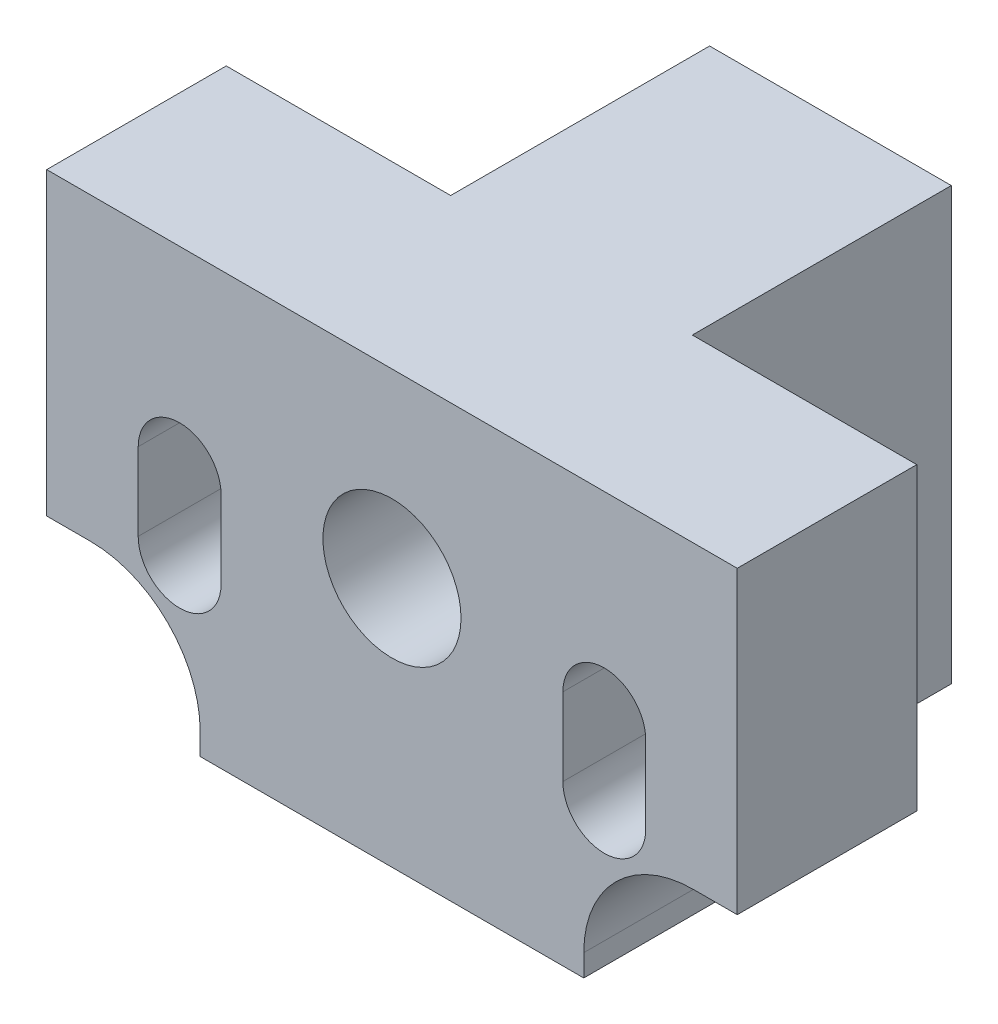
ISO-10303-21;
HEADER;
FILE_DESCRIPTION(('STEP AP214'),'2;1');
FILE_NAME('part.step','',(''),(''),'','','');
FILE_SCHEMA(('AUTOMOTIVE_DESIGN { 1 0 10303 214 1 1 1 1 }'));
ENDSEC;
DATA;
#1=APPLICATION_CONTEXT('core data for automotive mechanical design processes');
#2=APPLICATION_PROTOCOL_DEFINITION('international standard','automotive_design',2000,#1);
#3=PRODUCT_CONTEXT('',#1,'mechanical');
#4=PRODUCT('Part','Part','',(#3));
#5=PRODUCT_RELATED_PRODUCT_CATEGORY('part','',(#4));
#6=PRODUCT_DEFINITION_FORMATION('','',#4);
#7=PRODUCT_DEFINITION_CONTEXT('part definition',#1,'design');
#8=PRODUCT_DEFINITION('design','',#6,#7);
#9=PRODUCT_DEFINITION_SHAPE('','',#8);
#10=(LENGTH_UNIT() NAMED_UNIT(*) SI_UNIT(.MILLI.,.METRE.));
#11=(NAMED_UNIT(*) PLANE_ANGLE_UNIT() SI_UNIT($,.RADIAN.));
#12=(NAMED_UNIT(*) SI_UNIT($,.STERADIAN.) SOLID_ANGLE_UNIT());
#13=UNCERTAINTY_MEASURE_WITH_UNIT(LENGTH_MEASURE(1.E-05),#10,'distance_accuracy_value','');
#14=(GEOMETRIC_REPRESENTATION_CONTEXT(3) GLOBAL_UNCERTAINTY_ASSIGNED_CONTEXT((#13)) GLOBAL_UNIT_ASSIGNED_CONTEXT((#10,
#11,#12)) REPRESENTATION_CONTEXT('',''));
#15=CARTESIAN_POINT('',(0.,0.,0.));
#16=DIRECTION('',(0.,0.,1.));
#17=DIRECTION('',(1.,0.,0.));
#18=AXIS2_PLACEMENT_3D('',#15,#16,#17);
#19=CARTESIAN_POINT('',(-7.,25.,-25.4));
#20=DIRECTION('',(0.,0.,1.));
#21=DIRECTION('',(1.,0.,0.));
#22=AXIS2_PLACEMENT_3D('',#19,#20,#21);
#23=PLANE('',#22);
#24=DIRECTION('',(0.,-1.,0.));
#25=VECTOR('',#24,1.);
#26=CARTESIAN_POINT('',(7.,25.,-25.4));
#27=LINE('',#26,#25);
#28=CARTESIAN_POINT('',(7.,25.,-25.4));
#29=VERTEX_POINT('',#28);
#30=CARTESIAN_POINT('',(7.,0.,-25.4));
#31=VERTEX_POINT('',#30);
#32=EDGE_CURVE('E240',#29,#31,#27,.T.);
#33=ORIENTED_EDGE('',*,*,#32,.T.);
#34=DIRECTION('',(-1.,0.,0.));
#35=VECTOR('',#34,1.);
#36=CARTESIAN_POINT('',(-7.,0.,-25.4));
#37=LINE('',#36,#35);
#38=CARTESIAN_POINT('',(-7.,0.,-25.4));
#39=VERTEX_POINT('',#38);
#40=EDGE_CURVE('E328',#31,#39,#37,.T.);
#41=ORIENTED_EDGE('',*,*,#40,.T.);
#42=DIRECTION('',(0.,-1.,0.));
#43=VECTOR('',#42,1.);
#44=CARTESIAN_POINT('',(-7.,25.,-25.4));
#45=LINE('',#44,#43);
#46=CARTESIAN_POINT('',(-7.,25.,-25.4));
#47=VERTEX_POINT('',#46);
#48=EDGE_CURVE('E11',#47,#39,#45,.T.);
#49=ORIENTED_EDGE('',*,*,#48,.F.);
#50=DIRECTION('',(-1.,0.,0.));
#51=VECTOR('',#50,1.);
#52=CARTESIAN_POINT('',(-7.,25.,-25.4));
#53=LINE('',#52,#51);
#54=EDGE_CURVE('E329',#29,#47,#53,.T.);
#55=ORIENTED_EDGE('',*,*,#54,.F.);
#56=EDGE_LOOP('',(#33,#41,#49,#55));
#57=FACE_BOUND('',#56,.T.);
#58=CARTESIAN_POINT('',(0.,14.493996950254,-25.4));
#59=DIRECTION('',(0.,0.,1.));
#60=DIRECTION('',(1.,0.,0.));
#61=AXIS2_PLACEMENT_3D('',#58,#59,#60);
#62=CIRCLE('',#61,4.);
#63=CARTESIAN_POINT('',(4.,14.493996950254,-25.4));
#64=VERTEX_POINT('',#63);
#65=EDGE_CURVE('E279',#64,#64,#62,.T.);
#66=ORIENTED_EDGE('',*,*,#65,.T.);
#67=EDGE_LOOP('',(#66));
#68=FACE_BOUND('',#67,.T.);
#69=ADVANCED_FACE('F45',(#57,#68),#23,.F.);
#70=CARTESIAN_POINT('',(-7.,25.,-10.4));
#71=DIRECTION('',(1.,0.,0.));
#72=DIRECTION('',(0.,0.,-1.));
#73=AXIS2_PLACEMENT_3D('',#70,#71,#72);
#74=PLANE('',#73);
#75=DIRECTION('',(0.,0.,1.));
#76=VECTOR('',#75,1.);
#77=CARTESIAN_POINT('',(-7.,0.,-10.4));
#78=LINE('',#77,#76);
#79=CARTESIAN_POINT('',(-7.,0.,-10.4));
#80=VERTEX_POINT('',#79);
#81=EDGE_CURVE('E348',#39,#80,#78,.T.);
#82=ORIENTED_EDGE('',*,*,#81,.T.);
#83=DIRECTION('',(0.,-1.,0.));
#84=VECTOR('',#83,1.);
#85=CARTESIAN_POINT('',(-7.,25.,-10.4));
#86=LINE('',#85,#84);
#87=CARTESIAN_POINT('',(-7.,25.,-10.4));
#88=VERTEX_POINT('',#87);
#89=EDGE_CURVE('E53',#88,#80,#86,.T.);
#90=ORIENTED_EDGE('',*,*,#89,.F.);
#91=DIRECTION('',(0.,0.,1.));
#92=VECTOR('',#91,1.);
#93=CARTESIAN_POINT('',(-7.,25.,-10.4));
#94=LINE('',#93,#92);
#95=EDGE_CURVE('E332',#47,#88,#94,.T.);
#96=ORIENTED_EDGE('',*,*,#95,.F.);
#97=ORIENTED_EDGE('',*,*,#48,.T.);
#98=EDGE_LOOP('',(#82,#90,#96,#97));
#99=FACE_BOUND('',#98,.T.);
#100=ADVANCED_FACE('F395',(#99),#74,.F.);
#101=CARTESIAN_POINT('',(-20.,25.,-10.4));
#102=DIRECTION('',(0.,0.,1.));
#103=DIRECTION('',(1.,0.,0.));
#104=AXIS2_PLACEMENT_3D('',#101,#102,#103);
#105=PLANE('',#104);
#106=DIRECTION('',(0.,1.,0.));
#107=VECTOR('',#106,1.);
#108=CARTESIAN_POINT('',(-9.90000000000001,25.,-10.4));
#109=LINE('',#108,#107);
#110=CARTESIAN_POINT('',(-9.9,9.25,-10.4));
#111=VERTEX_POINT('',#110);
#112=CARTESIAN_POINT('',(-9.9,13.75,-10.4));
#113=VERTEX_POINT('',#112);
#114=EDGE_CURVE('E320',#111,#113,#109,.T.);
#115=ORIENTED_EDGE('',*,*,#114,.T.);
#116=CARTESIAN_POINT('',(-12.3,13.75,-10.4));
#117=DIRECTION('',(0.,0.,1.));
#118=DIRECTION('',(1.,0.,0.));
#119=AXIS2_PLACEMENT_3D('',#116,#117,#118);
#120=CIRCLE('',#119,2.4);
#121=CARTESIAN_POINT('',(-14.7,13.75,-10.4));
#122=VERTEX_POINT('',#121);
#123=EDGE_CURVE('E324',#113,#122,#120,.T.);
#124=ORIENTED_EDGE('',*,*,#123,.T.);
#125=DIRECTION('',(0.,-1.,0.));
#126=VECTOR('',#125,1.);
#127=CARTESIAN_POINT('',(-14.7,25.,-10.4));
#128=LINE('',#127,#126);
#129=CARTESIAN_POINT('',(-14.7,9.25,-10.4));
#130=VERTEX_POINT('',#129);
#131=EDGE_CURVE('E304',#122,#130,#128,.T.);
#132=ORIENTED_EDGE('',*,*,#131,.T.);
#133=CARTESIAN_POINT('',(-12.3,9.25,-10.4));
#134=DIRECTION('',(0.,0.,1.));
#135=DIRECTION('',(1.,0.,0.));
#136=AXIS2_PLACEMENT_3D('',#133,#134,#135);
#137=CIRCLE('',#136,2.4);
#138=EDGE_CURVE('E316',#130,#111,#137,.T.);
#139=ORIENTED_EDGE('',*,*,#138,.T.);
#140=EDGE_LOOP('',(#115,#124,#132,#139));
#141=FACE_BOUND('',#140,.T.);
#142=DIRECTION('',(-1.,0.,0.));
#143=VECTOR('',#142,1.);
#144=CARTESIAN_POINT('',(-20.,0.,-10.4));
#145=LINE('',#144,#143);
#146=CARTESIAN_POINT('',(-11.11,0.,-10.4));
#147=VERTEX_POINT('',#146);
#148=EDGE_CURVE('E351',#80,#147,#145,.T.);
#149=ORIENTED_EDGE('',*,*,#148,.T.);
#150=DIRECTION('',(0.,-1.,0.));
#151=VECTOR('',#150,1.);
#152=CARTESIAN_POINT('',(-11.11,0.,-10.4));
#153=LINE('',#152,#151);
#154=CARTESIAN_POINT('',(-11.11,1.27,-10.4));
#155=VERTEX_POINT('',#154);
#156=EDGE_CURVE('E60',#155,#147,#153,.T.);
#157=ORIENTED_EDGE('',*,*,#156,.F.);
#158=CARTESIAN_POINT('',(-17.46,1.27,-10.4));
#159=DIRECTION('',(0.,0.,-1.));
#160=DIRECTION('',(-1.,0.,0.));
#161=AXIS2_PLACEMENT_3D('',#158,#159,#160);
#162=CIRCLE('',#161,6.35);
#163=CARTESIAN_POINT('',(-17.46,7.62,-10.4));
#164=VERTEX_POINT('',#163);
#165=EDGE_CURVE('E261',#164,#155,#162,.T.);
#166=ORIENTED_EDGE('',*,*,#165,.F.);
#167=DIRECTION('',(1.,0.,0.));
#168=VECTOR('',#167,1.);
#169=CARTESIAN_POINT('',(-17.46,7.62,-10.4));
#170=LINE('',#169,#168);
#171=CARTESIAN_POINT('',(-20.,7.62,-10.4));
#172=VERTEX_POINT('',#171);
#173=EDGE_CURVE('E244',#172,#164,#170,.T.);
#174=ORIENTED_EDGE('',*,*,#173,.F.);
#175=DIRECTION('',(0.,-1.,0.));
#176=VECTOR('',#175,1.);
#177=CARTESIAN_POINT('',(-20.,25.,-10.4));
#178=LINE('',#177,#176);
#179=CARTESIAN_POINT('',(-20.,25.,-10.4));
#180=VERTEX_POINT('',#179);
#181=EDGE_CURVE('E360',#180,#172,#178,.T.);
#182=ORIENTED_EDGE('',*,*,#181,.F.);
#183=DIRECTION('',(-1.,0.,0.));
#184=VECTOR('',#183,1.);
#185=CARTESIAN_POINT('',(-20.,25.,-10.4));
#186=LINE('',#185,#184);
#187=EDGE_CURVE('E336',#88,#180,#186,.T.);
#188=ORIENTED_EDGE('',*,*,#187,.F.);
#189=ORIENTED_EDGE('',*,*,#89,.T.);
#190=EDGE_LOOP('',(#149,#157,#166,#174,#182,#188,#189));
#191=FACE_BOUND('',#190,.T.);
#192=ADVANCED_FACE('F369',(#141,#191),#105,.F.);
#193=CARTESIAN_POINT('',(-20.,25.,0.));
#194=DIRECTION('',(1.,0.,0.));
#195=DIRECTION('',(0.,0.,-1.));
#196=AXIS2_PLACEMENT_3D('',#193,#194,#195);
#197=PLANE('',#196);
#198=ORIENTED_EDGE('',*,*,#181,.T.);
#199=DIRECTION('',(0.,0.,-1.));
#200=VECTOR('',#199,1.);
#201=CARTESIAN_POINT('',(-20.,7.62,0.));
#202=LINE('',#201,#200);
#203=CARTESIAN_POINT('',(-20.,7.62,0.));
#204=VERTEX_POINT('',#203);
#205=EDGE_CURVE('E257',#204,#172,#202,.T.);
#206=ORIENTED_EDGE('',*,*,#205,.F.);
#207=DIRECTION('',(0.,-1.,0.));
#208=VECTOR('',#207,1.);
#209=CARTESIAN_POINT('',(-20.,25.,0.));
#210=LINE('',#209,#208);
#211=CARTESIAN_POINT('',(-20.,25.,0.));
#212=VERTEX_POINT('',#211);
#213=EDGE_CURVE('E345',#212,#204,#210,.T.);
#214=ORIENTED_EDGE('',*,*,#213,.F.);
#215=DIRECTION('',(0.,0.,1.));
#216=VECTOR('',#215,1.);
#217=CARTESIAN_POINT('',(-20.,25.,0.));
#218=LINE('',#217,#216);
#219=EDGE_CURVE('E339',#180,#212,#218,.T.);
#220=ORIENTED_EDGE('',*,*,#219,.F.);
#221=EDGE_LOOP('',(#198,#206,#214,#220));
#222=FACE_BOUND('',#221,.T.);
#223=ADVANCED_FACE('F389',(#222),#197,.F.);
#224=CARTESIAN_POINT('',(0.,25.,0.));
#225=DIRECTION('',(0.,0.,-1.));
#226=DIRECTION('',(-1.,0.,0.));
#227=AXIS2_PLACEMENT_3D('',#224,#225,#226);
#228=PLANE('',#227);
#229=DIRECTION('',(1.,0.,0.));
#230=VECTOR('',#229,1.);
#231=CARTESIAN_POINT('',(0.,0.,0.));
#232=LINE('',#231,#230);
#233=CARTESIAN_POINT('',(-11.11,0.,0.));
#234=VERTEX_POINT('',#233);
#235=CARTESIAN_POINT('',(11.11,0.,0.));
#236=VERTEX_POINT('',#235);
#237=EDGE_CURVE('E333',#234,#236,#232,.T.);
#238=ORIENTED_EDGE('',*,*,#237,.T.);
#239=DIRECTION('',(0.,-1.,0.));
#240=VECTOR('',#239,1.);
#241=CARTESIAN_POINT('',(11.11,0.,0.));
#242=LINE('',#241,#240);
#243=CARTESIAN_POINT('',(11.11,1.27,0.));
#244=VERTEX_POINT('',#243);
#245=EDGE_CURVE('E220',#244,#236,#242,.T.);
#246=ORIENTED_EDGE('',*,*,#245,.F.);
#247=CARTESIAN_POINT('',(17.46,1.27,0.));
#248=DIRECTION('',(0.,0.,1.));
#249=DIRECTION('',(1.,0.,0.));
#250=AXIS2_PLACEMENT_3D('',#247,#248,#249);
#251=CIRCLE('',#250,6.35);
#252=CARTESIAN_POINT('',(17.46,7.62,0.));
#253=VERTEX_POINT('',#252);
#254=EDGE_CURVE('E205',#253,#244,#251,.T.);
#255=ORIENTED_EDGE('',*,*,#254,.F.);
#256=DIRECTION('',(-1.,0.,0.));
#257=VECTOR('',#256,1.);
#258=CARTESIAN_POINT('',(17.46,7.62,0.));
#259=LINE('',#258,#257);
#260=CARTESIAN_POINT('',(20.,7.62,0.));
#261=VERTEX_POINT('',#260);
#262=EDGE_CURVE('E195',#261,#253,#259,.T.);
#263=ORIENTED_EDGE('',*,*,#262,.F.);
#264=DIRECTION('',(0.,-1.,0.));
#265=VECTOR('',#264,1.);
#266=CARTESIAN_POINT('',(20.,25.,0.));
#267=LINE('',#266,#265);
#268=CARTESIAN_POINT('',(20.,25.,0.));
#269=VERTEX_POINT('',#268);
#270=EDGE_CURVE('E201',#269,#261,#267,.T.);
#271=ORIENTED_EDGE('',*,*,#270,.F.);
#272=DIRECTION('',(1.,0.,0.));
#273=VECTOR('',#272,1.);
#274=CARTESIAN_POINT('',(0.,25.,0.));
#275=LINE('',#274,#273);
#276=EDGE_CURVE('E342',#212,#269,#275,.T.);
#277=ORIENTED_EDGE('',*,*,#276,.F.);
#278=ORIENTED_EDGE('',*,*,#213,.T.);
#279=DIRECTION('',(1.,0.,0.));
#280=VECTOR('',#279,1.);
#281=CARTESIAN_POINT('',(-17.46,7.62,0.));
#282=LINE('',#281,#280);
#283=CARTESIAN_POINT('',(-17.46,7.62,0.));
#284=VERTEX_POINT('',#283);
#285=EDGE_CURVE('E245',#204,#284,#282,.T.);
#286=ORIENTED_EDGE('',*,*,#285,.T.);
#287=CARTESIAN_POINT('',(-17.46,1.27,0.));
#288=DIRECTION('',(0.,0.,-1.));
#289=DIRECTION('',(-1.,0.,0.));
#290=AXIS2_PLACEMENT_3D('',#287,#288,#289);
#291=CIRCLE('',#290,6.35);
#292=CARTESIAN_POINT('',(-11.11,1.27,0.));
#293=VERTEX_POINT('',#292);
#294=EDGE_CURVE('E249',#284,#293,#291,.T.);
#295=ORIENTED_EDGE('',*,*,#294,.T.);
#296=DIRECTION('',(0.,-1.,0.));
#297=VECTOR('',#296,1.);
#298=CARTESIAN_POINT('',(-11.11,0.,0.));
#299=LINE('',#298,#297);
#300=EDGE_CURVE('E253',#293,#234,#299,.T.);
#301=ORIENTED_EDGE('',*,*,#300,.T.);
#302=EDGE_LOOP('',(#238,#246,#255,#263,#271,#277,#278,#286,#295,#301));
#303=FACE_BOUND('',#302,.T.);
#304=DIRECTION('',(0.,-1.,0.));
#305=VECTOR('',#304,1.);
#306=CARTESIAN_POINT('',(-14.7,13.75,0.));
#307=LINE('',#306,#305);
#308=CARTESIAN_POINT('',(-14.7,13.75,0.));
#309=VERTEX_POINT('',#308);
#310=CARTESIAN_POINT('',(-14.7,9.25,0.));
#311=VERTEX_POINT('',#310);
#312=EDGE_CURVE('E289',#309,#311,#307,.T.);
#313=ORIENTED_EDGE('',*,*,#312,.F.);
#314=CARTESIAN_POINT('',(-12.3,13.75,0.));
#315=DIRECTION('',(0.,0.,1.));
#316=DIRECTION('',(1.,0.,0.));
#317=AXIS2_PLACEMENT_3D('',#314,#315,#316);
#318=CIRCLE('',#317,2.4);
#319=CARTESIAN_POINT('',(-9.9,13.75,0.));
#320=VERTEX_POINT('',#319);
#321=EDGE_CURVE('E283',#320,#309,#318,.T.);
#322=ORIENTED_EDGE('',*,*,#321,.F.);
#323=DIRECTION('',(0.,1.,0.));
#324=VECTOR('',#323,1.);
#325=CARTESIAN_POINT('',(-9.9,13.75,0.));
#326=LINE('',#325,#324);
#327=CARTESIAN_POINT('',(-9.9,9.25,0.));
#328=VERTEX_POINT('',#327);
#329=EDGE_CURVE('E296',#328,#320,#326,.T.);
#330=ORIENTED_EDGE('',*,*,#329,.F.);
#331=CARTESIAN_POINT('',(-12.3,9.25,0.));
#332=DIRECTION('',(0.,0.,1.));
#333=DIRECTION('',(1.,0.,0.));
#334=AXIS2_PLACEMENT_3D('',#331,#332,#333);
#335=CIRCLE('',#334,2.4);
#336=EDGE_CURVE('E292',#311,#328,#335,.T.);
#337=ORIENTED_EDGE('',*,*,#336,.F.);
#338=EDGE_LOOP('',(#313,#322,#330,#337));
#339=FACE_BOUND('',#338,.T.);
#340=CARTESIAN_POINT('',(0.,14.493996950254,0.));
#341=DIRECTION('',(0.,0.,1.));
#342=DIRECTION('',(1.,0.,0.));
#343=AXIS2_PLACEMENT_3D('',#340,#341,#342);
#344=CIRCLE('',#343,4.);
#345=CARTESIAN_POINT('',(4.,14.493996950254,0.));
#346=VERTEX_POINT('',#345);
#347=EDGE_CURVE('E270',#346,#346,#344,.T.);
#348=ORIENTED_EDGE('',*,*,#347,.F.);
#349=EDGE_LOOP('',(#348));
#350=FACE_BOUND('',#349,.T.);
#351=DIRECTION('',(0.,-1.,0.));
#352=VECTOR('',#351,1.);
#353=CARTESIAN_POINT('',(14.7,13.75,0.));
#354=LINE('',#353,#352);
#355=CARTESIAN_POINT('',(14.7,13.75,0.));
#356=VERTEX_POINT('',#355);
#357=CARTESIAN_POINT('',(14.7,9.25,0.));
#358=VERTEX_POINT('',#357);
#359=EDGE_CURVE('E452',#356,#358,#354,.T.);
#360=ORIENTED_EDGE('',*,*,#359,.T.);
#361=CARTESIAN_POINT('',(12.3,9.25,0.));
#362=DIRECTION('',(0.,0.,-1.));
#363=DIRECTION('',(-1.,0.,0.));
#364=AXIS2_PLACEMENT_3D('',#361,#362,#363);
#365=CIRCLE('',#364,2.4);
#366=CARTESIAN_POINT('',(9.9,9.25,0.));
#367=VERTEX_POINT('',#366);
#368=EDGE_CURVE('E448',#358,#367,#365,.T.);
#369=ORIENTED_EDGE('',*,*,#368,.T.);
#370=DIRECTION('',(0.,1.,0.));
#371=VECTOR('',#370,1.);
#372=CARTESIAN_POINT('',(9.9,13.75,0.));
#373=LINE('',#372,#371);
#374=CARTESIAN_POINT('',(9.9,13.75,0.));
#375=VERTEX_POINT('',#374);
#376=EDGE_CURVE('E437',#367,#375,#373,.T.);
#377=ORIENTED_EDGE('',*,*,#376,.T.);
#378=CARTESIAN_POINT('',(12.3,13.75,0.));
#379=DIRECTION('',(0.,0.,-1.));
#380=DIRECTION('',(-1.,0.,0.));
#381=AXIS2_PLACEMENT_3D('',#378,#379,#380);
#382=CIRCLE('',#381,2.4);
#383=EDGE_CURVE('E456',#375,#356,#382,.T.);
#384=ORIENTED_EDGE('',*,*,#383,.T.);
#385=EDGE_LOOP('',(#360,#369,#377,#384));
#386=FACE_BOUND('',#385,.T.);
#387=ADVANCED_FACE('F197',(#303,#339,#350,#386),#228,.F.);
#388=CARTESIAN_POINT('',(0.,25.,0.));
#389=DIRECTION('',(0.,-1.,0.));
#390=DIRECTION('',(0.,0.,-1.));
#391=AXIS2_PLACEMENT_3D('',#388,#389,#390);
#392=PLANE('',#391);
#393=ORIENTED_EDGE('',*,*,#276,.T.);
#394=DIRECTION('',(0.,0.,1.));
#395=VECTOR('',#394,1.);
#396=CARTESIAN_POINT('',(20.,25.,0.));
#397=LINE('',#396,#395);
#398=CARTESIAN_POINT('',(20.,25.,-10.4));
#399=VERTEX_POINT('',#398);
#400=EDGE_CURVE('E223',#399,#269,#397,.T.);
#401=ORIENTED_EDGE('',*,*,#400,.F.);
#402=DIRECTION('',(1.,0.,0.));
#403=VECTOR('',#402,1.);
#404=CARTESIAN_POINT('',(20.,25.,-10.4));
#405=LINE('',#404,#403);
#406=CARTESIAN_POINT('',(7.,25.,-10.4));
#407=VERTEX_POINT('',#406);
#408=EDGE_CURVE('E231',#407,#399,#405,.T.);
#409=ORIENTED_EDGE('',*,*,#408,.F.);
#410=DIRECTION('',(0.,0.,1.));
#411=VECTOR('',#410,1.);
#412=CARTESIAN_POINT('',(7.,25.,-10.4));
#413=LINE('',#412,#411);
#414=EDGE_CURVE('E411',#29,#407,#413,.T.);
#415=ORIENTED_EDGE('',*,*,#414,.F.);
#416=ORIENTED_EDGE('',*,*,#54,.T.);
#417=ORIENTED_EDGE('',*,*,#95,.T.);
#418=ORIENTED_EDGE('',*,*,#187,.T.);
#419=ORIENTED_EDGE('',*,*,#219,.T.);
#420=EDGE_LOOP('',(#393,#401,#409,#415,#416,#417,#418,#419));
#421=FACE_BOUND('',#420,.T.);
#422=ADVANCED_FACE('F392',(#421),#392,.F.);
#423=CARTESIAN_POINT('',(0.,0.,0.));
#424=DIRECTION('',(0.,-1.,0.));
#425=DIRECTION('',(0.,0.,-1.));
#426=AXIS2_PLACEMENT_3D('',#423,#424,#425);
#427=PLANE('',#426);
#428=DIRECTION('',(0.,0.,-1.));
#429=VECTOR('',#428,1.);
#430=CARTESIAN_POINT('',(-11.11,0.,0.));
#431=LINE('',#430,#429);
#432=EDGE_CURVE('E267',#234,#147,#431,.T.);
#433=ORIENTED_EDGE('',*,*,#432,.T.);
#434=ORIENTED_EDGE('',*,*,#148,.F.);
#435=ORIENTED_EDGE('',*,*,#81,.F.);
#436=ORIENTED_EDGE('',*,*,#40,.F.);
#437=DIRECTION('',(0.,0.,1.));
#438=VECTOR('',#437,1.);
#439=CARTESIAN_POINT('',(7.,0.,-10.4));
#440=LINE('',#439,#438);
#441=CARTESIAN_POINT('',(7.,0.,-10.4));
#442=VERTEX_POINT('',#441);
#443=EDGE_CURVE('E402',#31,#442,#440,.T.);
#444=ORIENTED_EDGE('',*,*,#443,.T.);
#445=DIRECTION('',(1.,0.,0.));
#446=VECTOR('',#445,1.);
#447=CARTESIAN_POINT('',(20.,0.,-10.4));
#448=LINE('',#447,#446);
#449=CARTESIAN_POINT('',(11.11,0.,-10.4));
#450=VERTEX_POINT('',#449);
#451=EDGE_CURVE('E234',#442,#450,#448,.T.);
#452=ORIENTED_EDGE('',*,*,#451,.T.);
#453=DIRECTION('',(0.,0.,-1.));
#454=VECTOR('',#453,1.);
#455=CARTESIAN_POINT('',(11.11,0.,0.));
#456=LINE('',#455,#454);
#457=EDGE_CURVE('E459',#236,#450,#456,.T.);
#458=ORIENTED_EDGE('',*,*,#457,.F.);
#459=ORIENTED_EDGE('',*,*,#237,.F.);
#460=EDGE_LOOP('',(#433,#434,#435,#436,#444,#452,#458,#459));
#461=FACE_BOUND('',#460,.T.);
#462=ADVANCED_FACE('F375',(#461),#427,.T.);
#463=CARTESIAN_POINT('',(-12.3,13.75,-25.4));
#464=DIRECTION('',(0.,0.,1.));
#465=DIRECTION('',(1.,0.,0.));
#466=AXIS2_PLACEMENT_3D('',#463,#464,#465);
#467=CYLINDRICAL_SURFACE('',#466,2.4);
#468=DIRECTION('',(0.,0.,1.));
#469=VECTOR('',#468,1.);
#470=CARTESIAN_POINT('',(-9.9,13.75,-25.4));
#471=LINE('',#470,#469);
#472=EDGE_CURVE('E301',#113,#320,#471,.T.);
#473=ORIENTED_EDGE('',*,*,#472,.T.);
#474=ORIENTED_EDGE('',*,*,#321,.T.);
#475=DIRECTION('',(0.,0.,1.));
#476=VECTOR('',#475,1.);
#477=CARTESIAN_POINT('',(-14.7,13.75,-25.4));
#478=LINE('',#477,#476);
#479=EDGE_CURVE('E300',#122,#309,#478,.T.);
#480=ORIENTED_EDGE('',*,*,#479,.F.);
#481=ORIENTED_EDGE('',*,*,#123,.F.);
#482=EDGE_LOOP('',(#473,#474,#480,#481));
#483=FACE_BOUND('',#482,.T.);
#484=ADVANCED_FACE('F518',(#483),#467,.F.);
#485=CARTESIAN_POINT('',(-9.9,13.75,-25.4));
#486=DIRECTION('',(1.,0.,0.));
#487=DIRECTION('',(0.,1.,0.));
#488=AXIS2_PLACEMENT_3D('',#485,#486,#487);
#489=PLANE('',#488);
#490=DIRECTION('',(0.,0.,1.));
#491=VECTOR('',#490,1.);
#492=CARTESIAN_POINT('',(-9.9,9.25,-25.4));
#493=LINE('',#492,#491);
#494=EDGE_CURVE('E305',#111,#328,#493,.T.);
#495=ORIENTED_EDGE('',*,*,#494,.T.);
#496=ORIENTED_EDGE('',*,*,#329,.T.);
#497=ORIENTED_EDGE('',*,*,#472,.F.);
#498=ORIENTED_EDGE('',*,*,#114,.F.);
#499=EDGE_LOOP('',(#495,#496,#497,#498));
#500=FACE_BOUND('',#499,.T.);
#501=ADVANCED_FACE('F523',(#500),#489,.F.);
#502=CARTESIAN_POINT('',(-12.3,9.25,-25.4));
#503=DIRECTION('',(0.,0.,1.));
#504=DIRECTION('',(1.,0.,0.));
#505=AXIS2_PLACEMENT_3D('',#502,#503,#504);
#506=CYLINDRICAL_SURFACE('',#505,2.4);
#507=DIRECTION('',(0.,0.,1.));
#508=VECTOR('',#507,1.);
#509=CARTESIAN_POINT('',(-14.7,9.25,-25.4));
#510=LINE('',#509,#508);
#511=EDGE_CURVE('E68',#130,#311,#510,.T.);
#512=ORIENTED_EDGE('',*,*,#511,.T.);
#513=ORIENTED_EDGE('',*,*,#336,.T.);
#514=ORIENTED_EDGE('',*,*,#494,.F.);
#515=ORIENTED_EDGE('',*,*,#138,.F.);
#516=EDGE_LOOP('',(#512,#513,#514,#515));
#517=FACE_BOUND('',#516,.T.);
#518=ADVANCED_FACE('F529',(#517),#506,.F.);
#519=CARTESIAN_POINT('',(-14.7,13.75,-25.4));
#520=DIRECTION('',(-1.,0.,0.));
#521=DIRECTION('',(0.,-1.,0.));
#522=AXIS2_PLACEMENT_3D('',#519,#520,#521);
#523=PLANE('',#522);
#524=ORIENTED_EDGE('',*,*,#479,.T.);
#525=ORIENTED_EDGE('',*,*,#312,.T.);
#526=ORIENTED_EDGE('',*,*,#511,.F.);
#527=ORIENTED_EDGE('',*,*,#131,.F.);
#528=EDGE_LOOP('',(#524,#525,#526,#527));
#529=FACE_BOUND('',#528,.T.);
#530=ADVANCED_FACE('F525',(#529),#523,.F.);
#531=CARTESIAN_POINT('',(0.,14.493996950254,-25.4));
#532=DIRECTION('',(0.,0.,1.));
#533=DIRECTION('',(1.,0.,0.));
#534=AXIS2_PLACEMENT_3D('',#531,#532,#533);
#535=CYLINDRICAL_SURFACE('',#534,4.);
#536=CARTESIAN_POINT('',(4.,14.493996950254,0.));
#537=CARTESIAN_POINT('',(4.,14.493996950254,-0.264583333333333));
#538=CARTESIAN_POINT('',(4.,14.493996950254,-0.529166666666666));
#539=CARTESIAN_POINT('',(4.,14.493996950254,-1.05833333333333));
#540=CARTESIAN_POINT('',(4.,14.493996950254,-1.32291666666667));
#541=CARTESIAN_POINT('',(4.,14.493996950254,-1.85208333333333));
#542=CARTESIAN_POINT('',(4.,14.493996950254,-2.11666666666667));
#543=CARTESIAN_POINT('',(4.,14.493996950254,-2.64583333333333));
#544=CARTESIAN_POINT('',(4.,14.493996950254,-2.91041666666667));
#545=CARTESIAN_POINT('',(4.,14.493996950254,-3.43958333333333));
#546=CARTESIAN_POINT('',(4.,14.493996950254,-3.70416666666667));
#547=CARTESIAN_POINT('',(4.,14.493996950254,-4.23333333333333));
#548=CARTESIAN_POINT('',(4.,14.493996950254,-4.49791666666667));
#549=CARTESIAN_POINT('',(4.,14.493996950254,-5.02708333333334));
#550=CARTESIAN_POINT('',(4.,14.493996950254,-5.29166666666667));
#551=CARTESIAN_POINT('',(4.,14.493996950254,-5.82083333333333));
#552=CARTESIAN_POINT('',(4.,14.493996950254,-6.08541666666667));
#553=CARTESIAN_POINT('',(4.,14.493996950254,-6.61458333333333));
#554=CARTESIAN_POINT('',(4.,14.493996950254,-6.87916666666667));
#555=CARTESIAN_POINT('',(4.,14.493996950254,-7.40833333333333));
#556=CARTESIAN_POINT('',(4.,14.493996950254,-7.67291666666667));
#557=CARTESIAN_POINT('',(4.,14.493996950254,-8.20208333333333));
#558=CARTESIAN_POINT('',(4.,14.493996950254,-8.46666666666667));
#559=CARTESIAN_POINT('',(4.,14.493996950254,-8.99583333333334));
#560=CARTESIAN_POINT('',(4.,14.493996950254,-9.26041666666667));
#561=CARTESIAN_POINT('',(4.,14.493996950254,-9.78958333333333));
#562=CARTESIAN_POINT('',(4.,14.493996950254,-10.0541666666667));
#563=CARTESIAN_POINT('',(4.,14.493996950254,-10.5833333333333));
#564=CARTESIAN_POINT('',(4.,14.493996950254,-10.8479166666667));
#565=CARTESIAN_POINT('',(4.,14.493996950254,-11.3770833333333));
#566=CARTESIAN_POINT('',(4.,14.493996950254,-11.6416666666667));
#567=CARTESIAN_POINT('',(4.,14.493996950254,-12.1708333333333));
#568=CARTESIAN_POINT('',(4.,14.493996950254,-12.4354166666667));
#569=CARTESIAN_POINT('',(4.,14.493996950254,-12.9645833333333));
#570=CARTESIAN_POINT('',(4.,14.493996950254,-13.2291666666667));
#571=CARTESIAN_POINT('',(4.,14.493996950254,-13.7583333333333));
#572=CARTESIAN_POINT('',(4.,14.493996950254,-14.0229166666667));
#573=CARTESIAN_POINT('',(4.,14.493996950254,-14.5520833333333));
#574=CARTESIAN_POINT('',(4.,14.493996950254,-14.8166666666667));
#575=CARTESIAN_POINT('',(4.,14.493996950254,-15.3458333333333));
#576=CARTESIAN_POINT('',(4.,14.493996950254,-15.6104166666667));
#577=CARTESIAN_POINT('',(4.,14.493996950254,-16.1395833333333));
#578=CARTESIAN_POINT('',(4.,14.493996950254,-16.4041666666667));
#579=CARTESIAN_POINT('',(4.,14.493996950254,-16.9333333333333));
#580=CARTESIAN_POINT('',(4.,14.493996950254,-17.1979166666667));
#581=CARTESIAN_POINT('',(4.,14.493996950254,-17.7270833333333));
#582=CARTESIAN_POINT('',(4.,14.493996950254,-17.9916666666667));
#583=CARTESIAN_POINT('',(4.,14.493996950254,-18.5208333333333));
#584=CARTESIAN_POINT('',(4.,14.493996950254,-18.7854166666667));
#585=CARTESIAN_POINT('',(4.,14.493996950254,-19.3145833333333));
#586=CARTESIAN_POINT('',(4.,14.493996950254,-19.5791666666667));
#587=CARTESIAN_POINT('',(4.,14.493996950254,-20.1083333333333));
#588=CARTESIAN_POINT('',(4.,14.493996950254,-20.3729166666667));
#589=CARTESIAN_POINT('',(4.,14.493996950254,-20.9020833333333));
#590=CARTESIAN_POINT('',(4.,14.493996950254,-21.1666666666667));
#591=CARTESIAN_POINT('',(4.,14.493996950254,-21.6958333333333));
#592=CARTESIAN_POINT('',(4.,14.493996950254,-21.9604166666667));
#593=CARTESIAN_POINT('',(4.,14.493996950254,-22.4895833333333));
#594=CARTESIAN_POINT('',(4.,14.493996950254,-22.7541666666667));
#595=CARTESIAN_POINT('',(4.,14.493996950254,-23.2833333333333));
#596=CARTESIAN_POINT('',(4.,14.493996950254,-23.5479166666667));
#597=CARTESIAN_POINT('',(4.,14.493996950254,-24.0770833333333));
#598=CARTESIAN_POINT('',(4.,14.493996950254,-24.3416666666667));
#599=CARTESIAN_POINT('',(4.,14.493996950254,-24.8708333333333));
#600=CARTESIAN_POINT('',(4.,14.493996950254,-25.1354166666667));
#601=CARTESIAN_POINT('',(4.,14.493996950254,-25.4));
#602=B_SPLINE_CURVE_WITH_KNOTS('',3,(#536,#537,#538,#539,#540,#541,#542,#543,#544,#545,#546,
#547,#548,#549,#550,#551,#552,#553,#554,#555,#556,#557,#558,#559,#560,#561,#562,#563,#564,#565,
#566,#567,#568,#569,#570,#571,#572,#573,#574,#575,#576,#577,#578,#579,#580,#581,#582,#583,#584,
#585,#586,#587,#588,#589,#590,#591,#592,#593,#594,#595,#596,#597,#598,#599,#600,#601),
.UNSPECIFIED.,.F.,.F.,(4,2,2,2,2,2,2,2,2,2,2,2,2,2,2,2,2,2,2,2,2,2,2,2,2,2,2,2,2,2,2,2,4),(0.,
0.793749999999999,1.5875,2.38125,3.175,3.96875,4.7625,5.55625,6.35,7.14375,7.9375,8.73125,9.525,
10.31875,11.1125,11.90625,12.7,13.49375,14.2875,15.08125,15.875,16.66875,17.4625,18.25625,19.05,
19.84375,20.6375,21.43125,22.225,23.01875,23.8125,24.60625,25.4),.UNSPECIFIED.);
#603=EDGE_CURVE('BSEAM528',#346,#64,#602,.T.);
#604=ORIENTED_EDGE('',*,*,#347,.T.);
#605=ORIENTED_EDGE('',*,*,#65,.F.);
#606=ORIENTED_EDGE('',*,*,#603,.T.);
#607=ORIENTED_EDGE('',*,*,#603,.F.);
#608=EDGE_LOOP('',(#604,#606,#605,#607));
#609=FACE_BOUND('',#608,.T.);
#610=ADVANCED_FACE('F528',(#609),#535,.F.);
#611=CARTESIAN_POINT('',(-11.11,0.,0.));
#612=DIRECTION('',(1.,0.,0.));
#613=DIRECTION('',(0.,0.,-1.));
#614=AXIS2_PLACEMENT_3D('',#611,#612,#613);
#615=PLANE('',#614);
#616=ORIENTED_EDGE('',*,*,#156,.T.);
#617=ORIENTED_EDGE('',*,*,#432,.F.);
#618=ORIENTED_EDGE('',*,*,#300,.F.);
#619=DIRECTION('',(0.,0.,-1.));
#620=VECTOR('',#619,1.);
#621=CARTESIAN_POINT('',(-11.11,1.27,0.));
#622=LINE('',#621,#620);
#623=EDGE_CURVE('E271',#293,#155,#622,.T.);
#624=ORIENTED_EDGE('',*,*,#623,.T.);
#625=EDGE_LOOP('',(#616,#617,#618,#624));
#626=FACE_BOUND('',#625,.T.);
#627=ADVANCED_FACE('F379',(#626),#615,.F.);
#628=CARTESIAN_POINT('',(-17.46,1.27,0.));
#629=DIRECTION('',(0.,0.,-1.));
#630=DIRECTION('',(-1.,0.,0.));
#631=AXIS2_PLACEMENT_3D('',#628,#629,#630);
#632=CYLINDRICAL_SURFACE('',#631,6.35);
#633=ORIENTED_EDGE('',*,*,#165,.T.);
#634=ORIENTED_EDGE('',*,*,#623,.F.);
#635=ORIENTED_EDGE('',*,*,#294,.F.);
#636=DIRECTION('',(0.,0.,-1.));
#637=VECTOR('',#636,1.);
#638=CARTESIAN_POINT('',(-17.46,7.62,0.));
#639=LINE('',#638,#637);
#640=EDGE_CURVE('E274',#284,#164,#639,.T.);
#641=ORIENTED_EDGE('',*,*,#640,.T.);
#642=EDGE_LOOP('',(#633,#634,#635,#641));
#643=FACE_BOUND('',#642,.T.);
#644=ADVANCED_FACE('F382',(#643),#632,.F.);
#645=CARTESIAN_POINT('',(-17.46,7.62,0.));
#646=DIRECTION('',(0.,1.,0.));
#647=DIRECTION('',(0.,0.,1.));
#648=AXIS2_PLACEMENT_3D('',#645,#646,#647);
#649=PLANE('',#648);
#650=ORIENTED_EDGE('',*,*,#173,.T.);
#651=ORIENTED_EDGE('',*,*,#640,.F.);
#652=ORIENTED_EDGE('',*,*,#285,.F.);
#653=ORIENTED_EDGE('',*,*,#205,.T.);
#654=EDGE_LOOP('',(#650,#651,#652,#653));
#655=FACE_BOUND('',#654,.T.);
#656=ADVANCED_FACE('F539',(#655),#649,.F.);
#657=CARTESIAN_POINT('',(7.,25.,-10.4));
#658=DIRECTION('',(-1.,0.,0.));
#659=DIRECTION('',(0.,0.,-1.));
#660=AXIS2_PLACEMENT_3D('',#657,#658,#659);
#661=PLANE('',#660);
#662=ORIENTED_EDGE('',*,*,#443,.F.);
#663=ORIENTED_EDGE('',*,*,#32,.F.);
#664=ORIENTED_EDGE('',*,*,#414,.T.);
#665=DIRECTION('',(0.,-1.,0.));
#666=VECTOR('',#665,1.);
#667=CARTESIAN_POINT('',(7.,25.,-10.4));
#668=LINE('',#667,#666);
#669=EDGE_CURVE('E229',#407,#442,#668,.T.);
#670=ORIENTED_EDGE('',*,*,#669,.T.);
#671=EDGE_LOOP('',(#662,#663,#664,#670));
#672=FACE_BOUND('',#671,.T.);
#673=ADVANCED_FACE('F404',(#672),#661,.F.);
#674=CARTESIAN_POINT('',(20.,25.,-10.4));
#675=DIRECTION('',(0.,0.,1.));
#676=DIRECTION('',(-1.,0.,0.));
#677=AXIS2_PLACEMENT_3D('',#674,#675,#676);
#678=PLANE('',#677);
#679=DIRECTION('',(0.,1.,0.));
#680=VECTOR('',#679,1.);
#681=CARTESIAN_POINT('',(9.90000000000001,25.,-10.4));
#682=LINE('',#681,#680);
#683=CARTESIAN_POINT('',(9.9,9.25,-10.4));
#684=VERTEX_POINT('',#683);
#685=CARTESIAN_POINT('',(9.9,13.75,-10.4));
#686=VERTEX_POINT('',#685);
#687=EDGE_CURVE('E413',#684,#686,#682,.T.);
#688=ORIENTED_EDGE('',*,*,#687,.F.);
#689=CARTESIAN_POINT('',(12.3,9.25,-10.4));
#690=DIRECTION('',(0.,0.,-1.));
#691=DIRECTION('',(-1.,0.,0.));
#692=AXIS2_PLACEMENT_3D('',#689,#690,#691);
#693=CIRCLE('',#692,2.4);
#694=CARTESIAN_POINT('',(14.7,9.25,-10.4));
#695=VERTEX_POINT('',#694);
#696=EDGE_CURVE('E424',#695,#684,#693,.T.);
#697=ORIENTED_EDGE('',*,*,#696,.F.);
#698=DIRECTION('',(0.,-1.,0.));
#699=VECTOR('',#698,1.);
#700=CARTESIAN_POINT('',(14.7,25.,-10.4));
#701=LINE('',#700,#699);
#702=CARTESIAN_POINT('',(14.7,13.75,-10.4));
#703=VERTEX_POINT('',#702);
#704=EDGE_CURVE('E428',#703,#695,#701,.T.);
#705=ORIENTED_EDGE('',*,*,#704,.F.);
#706=CARTESIAN_POINT('',(12.3,13.75,-10.4));
#707=DIRECTION('',(0.,0.,-1.));
#708=DIRECTION('',(-1.,0.,0.));
#709=AXIS2_PLACEMENT_3D('',#706,#707,#708);
#710=CIRCLE('',#709,2.4);
#711=EDGE_CURVE('E408',#686,#703,#710,.T.);
#712=ORIENTED_EDGE('',*,*,#711,.F.);
#713=EDGE_LOOP('',(#688,#697,#705,#712));
#714=FACE_BOUND('',#713,.T.);
#715=ORIENTED_EDGE('',*,*,#451,.F.);
#716=ORIENTED_EDGE('',*,*,#669,.F.);
#717=ORIENTED_EDGE('',*,*,#408,.T.);
#718=DIRECTION('',(0.,-1.,0.));
#719=VECTOR('',#718,1.);
#720=CARTESIAN_POINT('',(20.,25.,-10.4));
#721=LINE('',#720,#719);
#722=CARTESIAN_POINT('',(20.,7.62,-10.4));
#723=VERTEX_POINT('',#722);
#724=EDGE_CURVE('E225',#399,#723,#721,.T.);
#725=ORIENTED_EDGE('',*,*,#724,.T.);
#726=DIRECTION('',(-1.,0.,0.));
#727=VECTOR('',#726,1.);
#728=CARTESIAN_POINT('',(17.46,7.62,-10.4));
#729=LINE('',#728,#727);
#730=CARTESIAN_POINT('',(17.46,7.62,-10.4));
#731=VERTEX_POINT('',#730);
#732=EDGE_CURVE('E214',#723,#731,#729,.T.);
#733=ORIENTED_EDGE('',*,*,#732,.T.);
#734=CARTESIAN_POINT('',(17.46,1.27,-10.4));
#735=DIRECTION('',(0.,0.,1.));
#736=DIRECTION('',(1.,0.,0.));
#737=AXIS2_PLACEMENT_3D('',#734,#735,#736);
#738=CIRCLE('',#737,6.35);
#739=CARTESIAN_POINT('',(11.11,1.27,-10.4));
#740=VERTEX_POINT('',#739);
#741=EDGE_CURVE('E471',#731,#740,#738,.T.);
#742=ORIENTED_EDGE('',*,*,#741,.T.);
#743=DIRECTION('',(0.,-1.,0.));
#744=VECTOR('',#743,1.);
#745=CARTESIAN_POINT('',(11.11,0.,-10.4));
#746=LINE('',#745,#744);
#747=EDGE_CURVE('E208',#740,#450,#746,.T.);
#748=ORIENTED_EDGE('',*,*,#747,.T.);
#749=EDGE_LOOP('',(#715,#716,#717,#725,#733,#742,#748));
#750=FACE_BOUND('',#749,.T.);
#751=ADVANCED_FACE('F486',(#714,#750),#678,.F.);
#752=CARTESIAN_POINT('',(20.,25.,0.));
#753=DIRECTION('',(-1.,0.,0.));
#754=DIRECTION('',(0.,0.,-1.));
#755=AXIS2_PLACEMENT_3D('',#752,#753,#754);
#756=PLANE('',#755);
#757=ORIENTED_EDGE('',*,*,#724,.F.);
#758=ORIENTED_EDGE('',*,*,#400,.T.);
#759=ORIENTED_EDGE('',*,*,#270,.T.);
#760=DIRECTION('',(0.,0.,-1.));
#761=VECTOR('',#760,1.);
#762=CARTESIAN_POINT('',(20.,7.62,0.));
#763=LINE('',#762,#761);
#764=EDGE_CURVE('E211',#261,#723,#763,.T.);
#765=ORIENTED_EDGE('',*,*,#764,.T.);
#766=EDGE_LOOP('',(#757,#758,#759,#765));
#767=FACE_BOUND('',#766,.T.);
#768=ADVANCED_FACE('F222',(#767),#756,.F.);
#769=CARTESIAN_POINT('',(12.3,13.75,-25.4));
#770=DIRECTION('',(0.,0.,1.));
#771=DIRECTION('',(-1.,0.,0.));
#772=AXIS2_PLACEMENT_3D('',#769,#770,#771);
#773=CYLINDRICAL_SURFACE('',#772,2.4);
#774=DIRECTION('',(0.,0.,1.));
#775=VECTOR('',#774,1.);
#776=CARTESIAN_POINT('',(9.9,13.75,-25.4));
#777=LINE('',#776,#775);
#778=EDGE_CURVE('E432',#686,#375,#777,.T.);
#779=ORIENTED_EDGE('',*,*,#778,.F.);
#780=ORIENTED_EDGE('',*,*,#711,.T.);
#781=DIRECTION('',(0.,0.,1.));
#782=VECTOR('',#781,1.);
#783=CARTESIAN_POINT('',(14.7,13.75,-25.4));
#784=LINE('',#783,#782);
#785=EDGE_CURVE('E433',#703,#356,#784,.T.);
#786=ORIENTED_EDGE('',*,*,#785,.T.);
#787=ORIENTED_EDGE('',*,*,#383,.F.);
#788=EDGE_LOOP('',(#779,#780,#786,#787));
#789=FACE_BOUND('',#788,.T.);
#790=ADVANCED_FACE('F553',(#789),#773,.F.);
#791=CARTESIAN_POINT('',(9.9,13.75,-25.4));
#792=DIRECTION('',(-1.,0.,0.));
#793=DIRECTION('',(0.,1.,0.));
#794=AXIS2_PLACEMENT_3D('',#791,#792,#793);
#795=PLANE('',#794);
#796=DIRECTION('',(0.,0.,1.));
#797=VECTOR('',#796,1.);
#798=CARTESIAN_POINT('',(9.9,9.25,-25.4));
#799=LINE('',#798,#797);
#800=EDGE_CURVE('E440',#684,#367,#799,.T.);
#801=ORIENTED_EDGE('',*,*,#800,.F.);
#802=ORIENTED_EDGE('',*,*,#687,.T.);
#803=ORIENTED_EDGE('',*,*,#778,.T.);
#804=ORIENTED_EDGE('',*,*,#376,.F.);
#805=EDGE_LOOP('',(#801,#802,#803,#804));
#806=FACE_BOUND('',#805,.T.);
#807=ADVANCED_FACE('F555',(#806),#795,.F.);
#808=CARTESIAN_POINT('',(12.3,9.25,-25.4));
#809=DIRECTION('',(0.,0.,1.));
#810=DIRECTION('',(-1.,0.,0.));
#811=AXIS2_PLACEMENT_3D('',#808,#809,#810);
#812=CYLINDRICAL_SURFACE('',#811,2.4);
#813=DIRECTION('',(0.,0.,1.));
#814=VECTOR('',#813,1.);
#815=CARTESIAN_POINT('',(14.7,9.25,-25.4));
#816=LINE('',#815,#814);
#817=EDGE_CURVE('E436',#695,#358,#816,.T.);
#818=ORIENTED_EDGE('',*,*,#817,.F.);
#819=ORIENTED_EDGE('',*,*,#696,.T.);
#820=ORIENTED_EDGE('',*,*,#800,.T.);
#821=ORIENTED_EDGE('',*,*,#368,.F.);
#822=EDGE_LOOP('',(#818,#819,#820,#821));
#823=FACE_BOUND('',#822,.T.);
#824=ADVANCED_FACE('F497',(#823),#812,.F.);
#825=CARTESIAN_POINT('',(14.7,13.75,-25.4));
#826=DIRECTION('',(1.,0.,0.));
#827=DIRECTION('',(0.,-1.,0.));
#828=AXIS2_PLACEMENT_3D('',#825,#826,#827);
#829=PLANE('',#828);
#830=ORIENTED_EDGE('',*,*,#785,.F.);
#831=ORIENTED_EDGE('',*,*,#704,.T.);
#832=ORIENTED_EDGE('',*,*,#817,.T.);
#833=ORIENTED_EDGE('',*,*,#359,.F.);
#834=EDGE_LOOP('',(#830,#831,#832,#833));
#835=FACE_BOUND('',#834,.T.);
#836=ADVANCED_FACE('F490',(#835),#829,.F.);
#837=CARTESIAN_POINT('',(11.11,0.,0.));
#838=DIRECTION('',(-1.,0.,0.));
#839=DIRECTION('',(0.,0.,-1.));
#840=AXIS2_PLACEMENT_3D('',#837,#838,#839);
#841=PLANE('',#840);
#842=ORIENTED_EDGE('',*,*,#747,.F.);
#843=DIRECTION('',(0.,0.,-1.));
#844=VECTOR('',#843,1.);
#845=CARTESIAN_POINT('',(11.11,1.27,0.));
#846=LINE('',#845,#844);
#847=EDGE_CURVE('E463',#244,#740,#846,.T.);
#848=ORIENTED_EDGE('',*,*,#847,.F.);
#849=ORIENTED_EDGE('',*,*,#245,.T.);
#850=ORIENTED_EDGE('',*,*,#457,.T.);
#851=EDGE_LOOP('',(#842,#848,#849,#850));
#852=FACE_BOUND('',#851,.T.);
#853=ADVANCED_FACE('F488',(#852),#841,.F.);
#854=CARTESIAN_POINT('',(17.46,1.27,0.));
#855=DIRECTION('',(0.,0.,-1.));
#856=DIRECTION('',(1.,0.,0.));
#857=AXIS2_PLACEMENT_3D('',#854,#855,#856);
#858=CYLINDRICAL_SURFACE('',#857,6.35);
#859=ORIENTED_EDGE('',*,*,#741,.F.);
#860=DIRECTION('',(0.,0.,-1.));
#861=VECTOR('',#860,1.);
#862=CARTESIAN_POINT('',(17.46,7.62,0.));
#863=LINE('',#862,#861);
#864=EDGE_CURVE('E219',#253,#731,#863,.T.);
#865=ORIENTED_EDGE('',*,*,#864,.F.);
#866=ORIENTED_EDGE('',*,*,#254,.T.);
#867=ORIENTED_EDGE('',*,*,#847,.T.);
#868=EDGE_LOOP('',(#859,#865,#866,#867));
#869=FACE_BOUND('',#868,.T.);
#870=ADVANCED_FACE('F483',(#869),#858,.F.);
#871=CARTESIAN_POINT('',(17.46,7.62,0.));
#872=DIRECTION('',(0.,1.,0.));
#873=DIRECTION('',(0.,0.,1.));
#874=AXIS2_PLACEMENT_3D('',#871,#872,#873);
#875=PLANE('',#874);
#876=ORIENTED_EDGE('',*,*,#732,.F.);
#877=ORIENTED_EDGE('',*,*,#764,.F.);
#878=ORIENTED_EDGE('',*,*,#262,.T.);
#879=ORIENTED_EDGE('',*,*,#864,.T.);
#880=EDGE_LOOP('',(#876,#877,#878,#879));
#881=FACE_BOUND('',#880,.T.);
#882=ADVANCED_FACE('F212',(#881),#875,.F.);
#883=CLOSED_SHELL('',(#69,#100,#192,#223,#387,#422,#462,#484,#501,#518,#530,#610,#627,#644,#656,
#673,#751,#768,#790,#807,#824,#836,#853,#870,#882));
#884=MANIFOLD_SOLID_BREP('B2',#883);
#885=ADVANCED_BREP_SHAPE_REPRESENTATION('',(#18,#884),#14);
#886=SHAPE_DEFINITION_REPRESENTATION(#9,#885);
ENDSEC;
END-ISO-10303-21;
